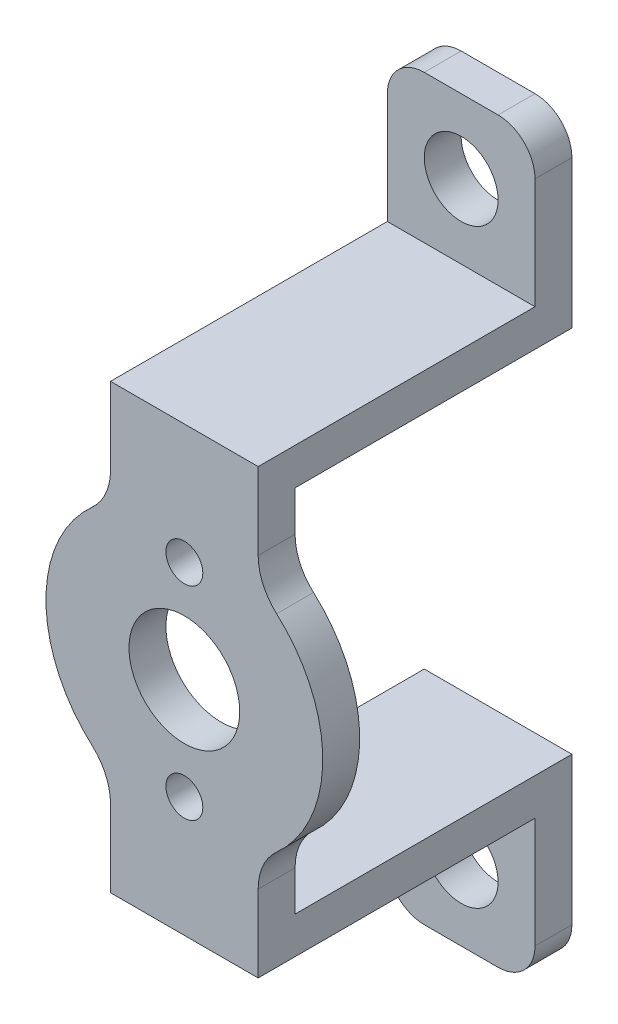
ISO-10303-21;
HEADER;
FILE_DESCRIPTION(('STEP AP214'),'2;1');
FILE_NAME('part.step','',(''),(''),'','','');
FILE_SCHEMA(('AUTOMOTIVE_DESIGN { 1 0 10303 214 1 1 1 1 }'));
ENDSEC;
DATA;
#1=APPLICATION_CONTEXT('core data for automotive mechanical design processes');
#2=APPLICATION_PROTOCOL_DEFINITION('international standard','automotive_design',2000,#1);
#3=PRODUCT_CONTEXT('',#1,'mechanical');
#4=PRODUCT('Part','Part','',(#3));
#5=PRODUCT_RELATED_PRODUCT_CATEGORY('part','',(#4));
#6=PRODUCT_DEFINITION_FORMATION('','',#4);
#7=PRODUCT_DEFINITION_CONTEXT('part definition',#1,'design');
#8=PRODUCT_DEFINITION('design','',#6,#7);
#9=PRODUCT_DEFINITION_SHAPE('','',#8);
#10=(LENGTH_UNIT() NAMED_UNIT(*) SI_UNIT(.MILLI.,.METRE.));
#11=(NAMED_UNIT(*) PLANE_ANGLE_UNIT() SI_UNIT($,.RADIAN.));
#12=(NAMED_UNIT(*) SI_UNIT($,.STERADIAN.) SOLID_ANGLE_UNIT());
#13=UNCERTAINTY_MEASURE_WITH_UNIT(LENGTH_MEASURE(1.E-05),#10,'distance_accuracy_value','');
#14=(GEOMETRIC_REPRESENTATION_CONTEXT(3) GLOBAL_UNCERTAINTY_ASSIGNED_CONTEXT((#13)) GLOBAL_UNIT_ASSIGNED_CONTEXT((#10,
#11,#12)) REPRESENTATION_CONTEXT('',''));
#15=CARTESIAN_POINT('',(0.,0.,0.));
#16=DIRECTION('',(0.,0.,1.));
#17=DIRECTION('',(1.,0.,0.));
#18=AXIS2_PLACEMENT_3D('',#15,#16,#17);
#19=CARTESIAN_POINT('',(0.,0.,2.));
#20=DIRECTION('',(0.,0.,-1.));
#21=DIRECTION('',(-1.,0.,0.));
#22=AXIS2_PLACEMENT_3D('',#19,#20,#21);
#23=CYLINDRICAL_SURFACE('',#22,7.5);
#24=CARTESIAN_POINT('',(0.,0.,0.));
#25=DIRECTION('',(0.,0.,1.));
#26=DIRECTION('',(1.,0.,0.));
#27=AXIS2_PLACEMENT_3D('',#24,#25,#26);
#28=CIRCLE('',#27,7.5);
#29=CARTESIAN_POINT('',(5.,-5.59016994374947,0.));
#30=VERTEX_POINT('',#29);
#31=CARTESIAN_POINT('',(5.,5.59016994374948,0.));
#32=VERTEX_POINT('',#31);
#33=EDGE_CURVE('E291',#30,#32,#28,.T.);
#34=ORIENTED_EDGE('',*,*,#33,.T.);
#35=DIRECTION('',(0.,0.,-1.));
#36=VECTOR('',#35,1.);
#37=CARTESIAN_POINT('',(5.,5.59016994374948,2.));
#38=LINE('',#37,#36);
#39=CARTESIAN_POINT('',(5.,5.59016994374948,2.));
#40=VERTEX_POINT('',#39);
#41=EDGE_CURVE('E347',#32,#40,#38,.F.);
#42=ORIENTED_EDGE('',*,*,#41,.T.);
#43=CARTESIAN_POINT('',(0.,0.,2.));
#44=DIRECTION('',(0.,0.,1.));
#45=DIRECTION('',(1.,0.,0.));
#46=AXIS2_PLACEMENT_3D('',#43,#44,#45);
#47=CIRCLE('',#46,7.5);
#48=CARTESIAN_POINT('',(5.,-5.59016994374947,2.));
#49=VERTEX_POINT('',#48);
#50=EDGE_CURVE('E300',#49,#40,#47,.T.);
#51=ORIENTED_EDGE('',*,*,#50,.F.);
#52=DIRECTION('',(0.,0.,-1.));
#53=VECTOR('',#52,1.);
#54=CARTESIAN_POINT('',(5.,-5.59016994374947,2.));
#55=LINE('',#54,#53);
#56=EDGE_CURVE('E344',#49,#30,#55,.T.);
#57=ORIENTED_EDGE('',*,*,#56,.T.);
#58=EDGE_LOOP('',(#34,#42,#51,#57));
#59=FACE_BOUND('',#58,.T.);
#60=ADVANCED_FACE('F36',(#59),#23,.T.);
#61=CARTESIAN_POINT('',(4.,0.,2.));
#62=DIRECTION('',(-1.,0.,0.));
#63=DIRECTION('',(0.,-1.,0.));
#64=AXIS2_PLACEMENT_3D('',#61,#62,#63);
#65=PLANE('',#64);
#66=DIRECTION('',(0.,-1.,0.));
#67=VECTOR('',#66,1.);
#68=CARTESIAN_POINT('',(4.,10.,-15.));
#69=LINE('',#68,#67);
#70=CARTESIAN_POINT('',(4.,18.,-15.));
#71=VERTEX_POINT('',#70);
#72=CARTESIAN_POINT('',(4.,10.,-15.));
#73=VERTEX_POINT('',#72);
#74=EDGE_CURVE('E245',#71,#73,#69,.T.);
#75=ORIENTED_EDGE('',*,*,#74,.F.);
#76=DIRECTION('',(0.,0.,1.));
#77=VECTOR('',#76,1.);
#78=CARTESIAN_POINT('',(4.,18.,2.));
#79=LINE('',#78,#77);
#80=CARTESIAN_POINT('',(4.,18.,-13.));
#81=VERTEX_POINT('',#80);
#82=EDGE_CURVE('E385',#71,#81,#79,.T.);
#83=ORIENTED_EDGE('',*,*,#82,.T.);
#84=DIRECTION('',(0.,-1.,0.));
#85=VECTOR('',#84,1.);
#86=CARTESIAN_POINT('',(4.,10.,-13.));
#87=LINE('',#86,#85);
#88=CARTESIAN_POINT('',(4.,12.,-13.));
#89=VERTEX_POINT('',#88);
#90=EDGE_CURVE('E229',#81,#89,#87,.T.);
#91=ORIENTED_EDGE('',*,*,#90,.T.);
#92=DIRECTION('',(0.,0.,1.));
#93=VECTOR('',#92,1.);
#94=CARTESIAN_POINT('',(4.,12.,-13.));
#95=LINE('',#94,#93);
#96=CARTESIAN_POINT('',(4.,12.,2.));
#97=VERTEX_POINT('',#96);
#98=EDGE_CURVE('E292',#89,#97,#95,.T.);
#99=ORIENTED_EDGE('',*,*,#98,.T.);
#100=DIRECTION('',(0.,1.,0.));
#101=VECTOR('',#100,1.);
#102=CARTESIAN_POINT('',(4.,0.,2.));
#103=LINE('',#102,#101);
#104=CARTESIAN_POINT('',(4.,7.82623792124926,2.));
#105=VERTEX_POINT('',#104);
#106=EDGE_CURVE('E303',#105,#97,#103,.T.);
#107=ORIENTED_EDGE('',*,*,#106,.F.);
#108=DIRECTION('',(0.,0.,1.));
#109=VECTOR('',#108,1.);
#110=CARTESIAN_POINT('',(4.,7.82623792124926,0.));
#111=LINE('',#110,#109);
#112=CARTESIAN_POINT('',(4.,7.82623792124926,0.));
#113=VERTEX_POINT('',#112);
#114=EDGE_CURVE('E341',#105,#113,#111,.F.);
#115=ORIENTED_EDGE('',*,*,#114,.T.);
#116=DIRECTION('',(0.,1.,0.));
#117=VECTOR('',#116,1.);
#118=CARTESIAN_POINT('',(4.,0.,0.));
#119=LINE('',#118,#117);
#120=CARTESIAN_POINT('',(4.,10.,0.));
#121=VERTEX_POINT('',#120);
#122=EDGE_CURVE('E320',#113,#121,#119,.T.);
#123=ORIENTED_EDGE('',*,*,#122,.T.);
#124=DIRECTION('',(0.,0.,1.));
#125=VECTOR('',#124,1.);
#126=CARTESIAN_POINT('',(4.,10.,-13.));
#127=LINE('',#126,#125);
#128=EDGE_CURVE('E295',#73,#121,#127,.T.);
#129=ORIENTED_EDGE('',*,*,#128,.F.);
#130=EDGE_LOOP('',(#75,#83,#91,#99,#107,#115,#123,#129));
#131=FACE_BOUND('',#130,.T.);
#132=ADVANCED_FACE('F406',(#131),#65,.F.);
#133=CARTESIAN_POINT('',(-4.,0.,2.));
#134=DIRECTION('',(-1.,0.,0.));
#135=DIRECTION('',(0.,0.,1.));
#136=AXIS2_PLACEMENT_3D('',#133,#134,#135);
#137=PLANE('',#136);
#138=DIRECTION('',(0.,1.,0.));
#139=VECTOR('',#138,1.);
#140=CARTESIAN_POINT('',(-4.,10.,-13.));
#141=LINE('',#140,#139);
#142=CARTESIAN_POINT('',(-4.,12.,-13.));
#143=VERTEX_POINT('',#142);
#144=CARTESIAN_POINT('',(-4.,18.,-13.));
#145=VERTEX_POINT('',#144);
#146=EDGE_CURVE('E231',#143,#145,#141,.T.);
#147=ORIENTED_EDGE('',*,*,#146,.T.);
#148=DIRECTION('',(0.,0.,1.));
#149=VECTOR('',#148,1.);
#150=CARTESIAN_POINT('',(-4.,18.,-15.));
#151=LINE('',#150,#149);
#152=CARTESIAN_POINT('',(-4.,18.,-15.));
#153=VERTEX_POINT('',#152);
#154=EDGE_CURVE('E11',#145,#153,#151,.F.);
#155=ORIENTED_EDGE('',*,*,#154,.T.);
#156=DIRECTION('',(0.,1.,0.));
#157=VECTOR('',#156,1.);
#158=CARTESIAN_POINT('',(-4.,10.,-15.));
#159=LINE('',#158,#157);
#160=CARTESIAN_POINT('',(-4.,10.,-15.));
#161=VERTEX_POINT('',#160);
#162=EDGE_CURVE('E251',#161,#153,#159,.T.);
#163=ORIENTED_EDGE('',*,*,#162,.F.);
#164=DIRECTION('',(0.,0.,1.));
#165=VECTOR('',#164,1.);
#166=CARTESIAN_POINT('',(-4.,10.,-13.));
#167=LINE('',#166,#165);
#168=CARTESIAN_POINT('',(-4.,10.,0.));
#169=VERTEX_POINT('',#168);
#170=EDGE_CURVE('E285',#161,#169,#167,.T.);
#171=ORIENTED_EDGE('',*,*,#170,.T.);
#172=DIRECTION('',(0.,1.,0.));
#173=VECTOR('',#172,1.);
#174=CARTESIAN_POINT('',(-4.,0.,0.));
#175=LINE('',#174,#173);
#176=CARTESIAN_POINT('',(-4.,7.82623792124926,0.));
#177=VERTEX_POINT('',#176);
#178=EDGE_CURVE('E325',#177,#169,#175,.T.);
#179=ORIENTED_EDGE('',*,*,#178,.F.);
#180=DIRECTION('',(0.,0.,-1.));
#181=VECTOR('',#180,1.);
#182=CARTESIAN_POINT('',(-4.,7.82623792124926,2.));
#183=LINE('',#182,#181);
#184=CARTESIAN_POINT('',(-4.,7.82623792124926,2.));
#185=VERTEX_POINT('',#184);
#186=EDGE_CURVE('E339',#177,#185,#183,.F.);
#187=ORIENTED_EDGE('',*,*,#186,.T.);
#188=DIRECTION('',(0.,1.,0.));
#189=VECTOR('',#188,1.);
#190=CARTESIAN_POINT('',(-4.,0.,2.));
#191=LINE('',#190,#189);
#192=CARTESIAN_POINT('',(-4.,12.,2.));
#193=VERTEX_POINT('',#192);
#194=EDGE_CURVE('E306',#185,#193,#191,.T.);
#195=ORIENTED_EDGE('',*,*,#194,.T.);
#196=DIRECTION('',(0.,0.,1.));
#197=VECTOR('',#196,1.);
#198=CARTESIAN_POINT('',(-4.,12.,-13.));
#199=LINE('',#198,#197);
#200=EDGE_CURVE('E288',#143,#193,#199,.T.);
#201=ORIENTED_EDGE('',*,*,#200,.F.);
#202=EDGE_LOOP('',(#147,#155,#163,#171,#179,#187,#195,#201));
#203=FACE_BOUND('',#202,.T.);
#204=ADVANCED_FACE('F419',(#203),#137,.T.);
#205=CARTESIAN_POINT('',(0.,0.,2.));
#206=DIRECTION('',(0.,0.,-1.));
#207=DIRECTION('',(-1.,0.,0.));
#208=AXIS2_PLACEMENT_3D('',#205,#206,#207);
#209=CYLINDRICAL_SURFACE('',#208,7.5);
#210=CARTESIAN_POINT('',(0.,0.,2.));
#211=DIRECTION('',(0.,0.,1.));
#212=DIRECTION('',(1.,0.,0.));
#213=AXIS2_PLACEMENT_3D('',#210,#211,#212);
#214=CIRCLE('',#213,7.5);
#215=CARTESIAN_POINT('',(-5.,5.59016994374947,2.));
#216=VERTEX_POINT('',#215);
#217=CARTESIAN_POINT('',(-5.,-5.59016994374947,2.));
#218=VERTEX_POINT('',#217);
#219=EDGE_CURVE('E308',#216,#218,#214,.T.);
#220=ORIENTED_EDGE('',*,*,#219,.F.);
#221=DIRECTION('',(0.,0.,-1.));
#222=VECTOR('',#221,1.);
#223=CARTESIAN_POINT('',(-5.,5.59016994374947,2.));
#224=LINE('',#223,#222);
#225=CARTESIAN_POINT('',(-5.,5.59016994374947,0.));
#226=VERTEX_POINT('',#225);
#227=EDGE_CURVE('E336',#216,#226,#224,.T.);
#228=ORIENTED_EDGE('',*,*,#227,.T.);
#229=CARTESIAN_POINT('',(0.,0.,0.));
#230=DIRECTION('',(0.,0.,1.));
#231=DIRECTION('',(1.,0.,0.));
#232=AXIS2_PLACEMENT_3D('',#229,#230,#231);
#233=CIRCLE('',#232,7.5);
#234=CARTESIAN_POINT('',(-5.,-5.59016994374947,0.));
#235=VERTEX_POINT('',#234);
#236=EDGE_CURVE('E327',#226,#235,#233,.T.);
#237=ORIENTED_EDGE('',*,*,#236,.T.);
#238=DIRECTION('',(0.,0.,-1.));
#239=VECTOR('',#238,1.);
#240=CARTESIAN_POINT('',(-5.,-5.59016994374947,2.));
#241=LINE('',#240,#239);
#242=EDGE_CURVE('E317',#235,#218,#241,.F.);
#243=ORIENTED_EDGE('',*,*,#242,.T.);
#244=EDGE_LOOP('',(#220,#228,#237,#243));
#245=FACE_BOUND('',#244,.T.);
#246=ADVANCED_FACE('F725',(#245),#209,.T.);
#247=CARTESIAN_POINT('',(-4.,0.,2.));
#248=DIRECTION('',(-1.,0.,0.));
#249=DIRECTION('',(0.,0.,1.));
#250=AXIS2_PLACEMENT_3D('',#247,#248,#249);
#251=PLANE('',#250);
#252=DIRECTION('',(0.,1.,0.));
#253=VECTOR('',#252,1.);
#254=CARTESIAN_POINT('',(-4.,-10.,-15.));
#255=LINE('',#254,#253);
#256=CARTESIAN_POINT('',(-4.,-18.,-15.));
#257=VERTEX_POINT('',#256);
#258=CARTESIAN_POINT('',(-4.,-10.,-15.));
#259=VERTEX_POINT('',#258);
#260=EDGE_CURVE('E200',#257,#259,#255,.T.);
#261=ORIENTED_EDGE('',*,*,#260,.F.);
#262=DIRECTION('',(0.,0.,1.));
#263=VECTOR('',#262,1.);
#264=CARTESIAN_POINT('',(-4.,-18.,-13.));
#265=LINE('',#264,#263);
#266=CARTESIAN_POINT('',(-4.,-18.,-13.));
#267=VERTEX_POINT('',#266);
#268=EDGE_CURVE('E369',#257,#267,#265,.T.);
#269=ORIENTED_EDGE('',*,*,#268,.T.);
#270=DIRECTION('',(0.,1.,0.));
#271=VECTOR('',#270,1.);
#272=CARTESIAN_POINT('',(-4.,-10.,-13.));
#273=LINE('',#272,#271);
#274=CARTESIAN_POINT('',(-4.,-12.,-13.));
#275=VERTEX_POINT('',#274);
#276=EDGE_CURVE('E242',#267,#275,#273,.T.);
#277=ORIENTED_EDGE('',*,*,#276,.T.);
#278=DIRECTION('',(0.,0.,1.));
#279=VECTOR('',#278,1.);
#280=CARTESIAN_POINT('',(-4.,-12.,-13.));
#281=LINE('',#280,#279);
#282=CARTESIAN_POINT('',(-4.,-12.,2.));
#283=VERTEX_POINT('',#282);
#284=EDGE_CURVE('E273',#275,#283,#281,.T.);
#285=ORIENTED_EDGE('',*,*,#284,.T.);
#286=DIRECTION('',(0.,1.,0.));
#287=VECTOR('',#286,1.);
#288=CARTESIAN_POINT('',(-4.,0.,2.));
#289=LINE('',#288,#287);
#290=CARTESIAN_POINT('',(-4.,-7.82623792124926,2.));
#291=VERTEX_POINT('',#290);
#292=EDGE_CURVE('E311',#283,#291,#289,.T.);
#293=ORIENTED_EDGE('',*,*,#292,.T.);
#294=DIRECTION('',(0.,0.,-1.));
#295=VECTOR('',#294,1.);
#296=CARTESIAN_POINT('',(-4.,-7.82623792124926,2.));
#297=LINE('',#296,#295);
#298=CARTESIAN_POINT('',(-4.,-7.82623792124926,0.));
#299=VERTEX_POINT('',#298);
#300=EDGE_CURVE('E351',#291,#299,#297,.T.);
#301=ORIENTED_EDGE('',*,*,#300,.T.);
#302=DIRECTION('',(0.,1.,0.));
#303=VECTOR('',#302,1.);
#304=CARTESIAN_POINT('',(-4.,0.,0.));
#305=LINE('',#304,#303);
#306=CARTESIAN_POINT('',(-4.,-10.,0.));
#307=VERTEX_POINT('',#306);
#308=EDGE_CURVE('E221',#307,#299,#305,.T.);
#309=ORIENTED_EDGE('',*,*,#308,.F.);
#310=DIRECTION('',(0.,0.,1.));
#311=VECTOR('',#310,1.);
#312=CARTESIAN_POINT('',(-4.,-10.,-13.));
#313=LINE('',#312,#311);
#314=EDGE_CURVE('E217',#259,#307,#313,.T.);
#315=ORIENTED_EDGE('',*,*,#314,.F.);
#316=EDGE_LOOP('',(#261,#269,#277,#285,#293,#301,#309,#315));
#317=FACE_BOUND('',#316,.T.);
#318=ADVANCED_FACE('F218',(#317),#251,.T.);
#319=CARTESIAN_POINT('',(4.,0.,2.));
#320=DIRECTION('',(-1.,0.,0.));
#321=DIRECTION('',(0.,-1.,0.));
#322=AXIS2_PLACEMENT_3D('',#319,#320,#321);
#323=PLANE('',#322);
#324=DIRECTION('',(0.,-1.,0.));
#325=VECTOR('',#324,1.);
#326=CARTESIAN_POINT('',(4.,-10.,-13.));
#327=LINE('',#326,#325);
#328=CARTESIAN_POINT('',(4.,-12.,-13.));
#329=VERTEX_POINT('',#328);
#330=CARTESIAN_POINT('',(4.,-18.,-13.));
#331=VERTEX_POINT('',#330);
#332=EDGE_CURVE('E235',#329,#331,#327,.T.);
#333=ORIENTED_EDGE('',*,*,#332,.T.);
#334=DIRECTION('',(0.,0.,1.));
#335=VECTOR('',#334,1.);
#336=CARTESIAN_POINT('',(4.,-18.,2.));
#337=LINE('',#336,#335);
#338=CARTESIAN_POINT('',(4.,-18.,-15.));
#339=VERTEX_POINT('',#338);
#340=EDGE_CURVE('E383',#331,#339,#337,.F.);
#341=ORIENTED_EDGE('',*,*,#340,.T.);
#342=DIRECTION('',(0.,-1.,0.));
#343=VECTOR('',#342,1.);
#344=CARTESIAN_POINT('',(4.,-10.,-15.));
#345=LINE('',#344,#343);
#346=CARTESIAN_POINT('',(4.,-10.,-15.));
#347=VERTEX_POINT('',#346);
#348=EDGE_CURVE('E244',#347,#339,#345,.T.);
#349=ORIENTED_EDGE('',*,*,#348,.F.);
#350=DIRECTION('',(0.,0.,1.));
#351=VECTOR('',#350,1.);
#352=CARTESIAN_POINT('',(4.,-10.,-13.));
#353=LINE('',#352,#351);
#354=CARTESIAN_POINT('',(4.,-10.,0.));
#355=VERTEX_POINT('',#354);
#356=EDGE_CURVE('E225',#347,#355,#353,.T.);
#357=ORIENTED_EDGE('',*,*,#356,.T.);
#358=DIRECTION('',(0.,1.,0.));
#359=VECTOR('',#358,1.);
#360=CARTESIAN_POINT('',(4.,0.,0.));
#361=LINE('',#360,#359);
#362=CARTESIAN_POINT('',(4.,-7.82623792124926,0.));
#363=VERTEX_POINT('',#362);
#364=EDGE_CURVE('E304',#355,#363,#361,.T.);
#365=ORIENTED_EDGE('',*,*,#364,.T.);
#366=DIRECTION('',(0.,0.,1.));
#367=VECTOR('',#366,1.);
#368=CARTESIAN_POINT('',(4.,-7.82623792124926,2.));
#369=LINE('',#368,#367);
#370=CARTESIAN_POINT('',(4.,-7.82623792124926,2.));
#371=VERTEX_POINT('',#370);
#372=EDGE_CURVE('E349',#363,#371,#369,.T.);
#373=ORIENTED_EDGE('',*,*,#372,.T.);
#374=DIRECTION('',(0.,1.,0.));
#375=VECTOR('',#374,1.);
#376=CARTESIAN_POINT('',(4.,0.,2.));
#377=LINE('',#376,#375);
#378=CARTESIAN_POINT('',(4.,-12.,2.));
#379=VERTEX_POINT('',#378);
#380=EDGE_CURVE('E314',#379,#371,#377,.T.);
#381=ORIENTED_EDGE('',*,*,#380,.F.);
#382=DIRECTION('',(0.,0.,1.));
#383=VECTOR('',#382,1.);
#384=CARTESIAN_POINT('',(4.,-12.,-13.));
#385=LINE('',#384,#383);
#386=EDGE_CURVE('E277',#329,#379,#385,.T.);
#387=ORIENTED_EDGE('',*,*,#386,.F.);
#388=EDGE_LOOP('',(#333,#341,#349,#357,#365,#373,#381,#387));
#389=FACE_BOUND('',#388,.T.);
#390=ADVANCED_FACE('F444',(#389),#323,.F.);
#391=CARTESIAN_POINT('',(0.,0.,2.));
#392=DIRECTION('',(0.,0.,1.));
#393=DIRECTION('',(1.,0.,0.));
#394=AXIS2_PLACEMENT_3D('',#391,#392,#393);
#395=PLANE('',#394);
#396=CARTESIAN_POINT('',(0.,0.,2.));
#397=DIRECTION('',(0.,0.,1.));
#398=DIRECTION('',(1.,0.,0.));
#399=AXIS2_PLACEMENT_3D('',#396,#397,#398);
#400=CIRCLE('',#399,3.);
#401=CARTESIAN_POINT('',(3.,0.,2.));
#402=VERTEX_POINT('',#401);
#403=EDGE_CURVE('E460',#402,#402,#400,.T.);
#404=ORIENTED_EDGE('',*,*,#403,.F.);
#405=EDGE_LOOP('',(#404));
#406=FACE_BOUND('',#405,.T.);
#407=CARTESIAN_POINT('',(0.,5.5,2.));
#408=DIRECTION('',(0.,0.,1.));
#409=DIRECTION('',(1.,0.,0.));
#410=AXIS2_PLACEMENT_3D('',#407,#408,#409);
#411=CIRCLE('',#410,1.);
#412=CARTESIAN_POINT('',(1.,5.5,2.));
#413=VERTEX_POINT('',#412);
#414=EDGE_CURVE('E266',#413,#413,#411,.T.);
#415=ORIENTED_EDGE('',*,*,#414,.F.);
#416=EDGE_LOOP('',(#415));
#417=FACE_BOUND('',#416,.T.);
#418=CARTESIAN_POINT('',(0.,-5.5,2.));
#419=DIRECTION('',(0.,0.,1.));
#420=DIRECTION('',(1.,0.,0.));
#421=AXIS2_PLACEMENT_3D('',#418,#419,#420);
#422=CIRCLE('',#421,1.);
#423=CARTESIAN_POINT('',(1.,-5.5,2.));
#424=VERTEX_POINT('',#423);
#425=EDGE_CURVE('E261',#424,#424,#422,.T.);
#426=ORIENTED_EDGE('',*,*,#425,.F.);
#427=EDGE_LOOP('',(#426));
#428=FACE_BOUND('',#427,.T.);
#429=ORIENTED_EDGE('',*,*,#380,.T.);
#430=CARTESIAN_POINT('',(7.,-7.82623792124926,2.));
#431=DIRECTION('',(0.,0.,1.));
#432=DIRECTION('',(1.,0.,0.));
#433=AXIS2_PLACEMENT_3D('',#430,#431,#432);
#434=CIRCLE('',#433,3.);
#435=EDGE_CURVE('E363',#371,#49,#434,.F.);
#436=ORIENTED_EDGE('',*,*,#435,.T.);
#437=ORIENTED_EDGE('',*,*,#50,.T.);
#438=CARTESIAN_POINT('',(7.,7.82623792124926,2.));
#439=DIRECTION('',(0.,0.,1.));
#440=DIRECTION('',(1.,0.,0.));
#441=AXIS2_PLACEMENT_3D('',#438,#439,#440);
#442=CIRCLE('',#441,3.);
#443=EDGE_CURVE('E359',#40,#105,#442,.F.);
#444=ORIENTED_EDGE('',*,*,#443,.T.);
#445=ORIENTED_EDGE('',*,*,#106,.T.);
#446=DIRECTION('',(-1.,0.,0.));
#447=VECTOR('',#446,1.);
#448=CARTESIAN_POINT('',(-4.,12.,2.));
#449=LINE('',#448,#447);
#450=EDGE_CURVE('E224',#97,#193,#449,.T.);
#451=ORIENTED_EDGE('',*,*,#450,.T.);
#452=ORIENTED_EDGE('',*,*,#194,.F.);
#453=CARTESIAN_POINT('',(-7.,7.82623792124926,2.));
#454=DIRECTION('',(0.,0.,1.));
#455=DIRECTION('',(1.,0.,0.));
#456=AXIS2_PLACEMENT_3D('',#453,#454,#455);
#457=CIRCLE('',#456,3.);
#458=EDGE_CURVE('E355',#185,#216,#457,.F.);
#459=ORIENTED_EDGE('',*,*,#458,.T.);
#460=ORIENTED_EDGE('',*,*,#219,.T.);
#461=CARTESIAN_POINT('',(-7.,-7.82623792124926,2.));
#462=DIRECTION('',(0.,0.,1.));
#463=DIRECTION('',(1.,0.,0.));
#464=AXIS2_PLACEMENT_3D('',#461,#462,#463);
#465=CIRCLE('',#464,3.);
#466=EDGE_CURVE('E367',#218,#291,#465,.F.);
#467=ORIENTED_EDGE('',*,*,#466,.T.);
#468=ORIENTED_EDGE('',*,*,#292,.F.);
#469=DIRECTION('',(1.,0.,0.));
#470=VECTOR('',#469,1.);
#471=CARTESIAN_POINT('',(-4.,-12.,2.));
#472=LINE('',#471,#470);
#473=EDGE_CURVE('E269',#283,#379,#472,.T.);
#474=ORIENTED_EDGE('',*,*,#473,.T.);
#475=EDGE_LOOP('',(#429,#436,#437,#444,#445,#451,#452,#459,#460,#467,#468,#474));
#476=FACE_BOUND('',#475,.T.);
#477=ADVANCED_FACE('F519',(#406,#417,#428,#476),#395,.T.);
#478=CARTESIAN_POINT('',(0.,0.,0.));
#479=DIRECTION('',(0.,0.,1.));
#480=DIRECTION('',(1.,0.,0.));
#481=AXIS2_PLACEMENT_3D('',#478,#479,#480);
#482=PLANE('',#481);
#483=CARTESIAN_POINT('',(0.,0.,0.));
#484=DIRECTION('',(0.,0.,1.));
#485=DIRECTION('',(1.,0.,0.));
#486=AXIS2_PLACEMENT_3D('',#483,#484,#485);
#487=CIRCLE('',#486,3.);
#488=CARTESIAN_POINT('',(3.,0.,0.));
#489=VERTEX_POINT('',#488);
#490=EDGE_CURVE('E40',#489,#489,#487,.T.);
#491=ORIENTED_EDGE('',*,*,#490,.T.);
#492=EDGE_LOOP('',(#491));
#493=FACE_BOUND('',#492,.T.);
#494=CARTESIAN_POINT('',(0.,5.5,0.));
#495=DIRECTION('',(0.,0.,-1.));
#496=DIRECTION('',(-1.,0.,0.));
#497=AXIS2_PLACEMENT_3D('',#494,#495,#496);
#498=CIRCLE('',#497,1.);
#499=CARTESIAN_POINT('',(-1.,5.5,0.));
#500=VERTEX_POINT('',#499);
#501=EDGE_CURVE('E258',#500,#500,#498,.T.);
#502=ORIENTED_EDGE('',*,*,#501,.F.);
#503=EDGE_LOOP('',(#502));
#504=FACE_BOUND('',#503,.T.);
#505=CARTESIAN_POINT('',(0.,-5.5,0.));
#506=DIRECTION('',(0.,0.,-1.));
#507=DIRECTION('',(-1.,0.,0.));
#508=AXIS2_PLACEMENT_3D('',#505,#506,#507);
#509=CIRCLE('',#508,1.);
#510=CARTESIAN_POINT('',(-1.,-5.5,0.));
#511=VERTEX_POINT('',#510);
#512=EDGE_CURVE('E254',#511,#511,#509,.T.);
#513=ORIENTED_EDGE('',*,*,#512,.F.);
#514=EDGE_LOOP('',(#513));
#515=FACE_BOUND('',#514,.T.);
#516=ORIENTED_EDGE('',*,*,#33,.F.);
#517=CARTESIAN_POINT('',(7.,-7.82623792124926,0.));
#518=DIRECTION('',(0.,0.,1.));
#519=DIRECTION('',(1.,0.,0.));
#520=AXIS2_PLACEMENT_3D('',#517,#518,#519);
#521=CIRCLE('',#520,3.);
#522=EDGE_CURVE('E361',#30,#363,#521,.T.);
#523=ORIENTED_EDGE('',*,*,#522,.T.);
#524=ORIENTED_EDGE('',*,*,#364,.F.);
#525=DIRECTION('',(1.,0.,0.));
#526=VECTOR('',#525,1.);
#527=CARTESIAN_POINT('',(0.,-10.,0.));
#528=LINE('',#527,#526);
#529=EDGE_CURVE('E331',#307,#355,#528,.T.);
#530=ORIENTED_EDGE('',*,*,#529,.F.);
#531=ORIENTED_EDGE('',*,*,#308,.T.);
#532=CARTESIAN_POINT('',(-7.,-7.82623792124926,0.));
#533=DIRECTION('',(0.,0.,1.));
#534=DIRECTION('',(1.,0.,0.));
#535=AXIS2_PLACEMENT_3D('',#532,#533,#534);
#536=CIRCLE('',#535,3.);
#537=EDGE_CURVE('E365',#299,#235,#536,.T.);
#538=ORIENTED_EDGE('',*,*,#537,.T.);
#539=ORIENTED_EDGE('',*,*,#236,.F.);
#540=CARTESIAN_POINT('',(-7.,7.82623792124926,0.));
#541=DIRECTION('',(0.,0.,1.));
#542=DIRECTION('',(1.,0.,0.));
#543=AXIS2_PLACEMENT_3D('',#540,#541,#542);
#544=CIRCLE('',#543,3.);
#545=EDGE_CURVE('E353',#226,#177,#544,.T.);
#546=ORIENTED_EDGE('',*,*,#545,.T.);
#547=ORIENTED_EDGE('',*,*,#178,.T.);
#548=DIRECTION('',(1.,0.,0.));
#549=VECTOR('',#548,1.);
#550=CARTESIAN_POINT('',(0.,10.,0.));
#551=LINE('',#550,#549);
#552=EDGE_CURVE('E322',#169,#121,#551,.T.);
#553=ORIENTED_EDGE('',*,*,#552,.T.);
#554=ORIENTED_EDGE('',*,*,#122,.F.);
#555=CARTESIAN_POINT('',(7.,7.82623792124926,0.));
#556=DIRECTION('',(0.,0.,1.));
#557=DIRECTION('',(1.,0.,0.));
#558=AXIS2_PLACEMENT_3D('',#555,#556,#557);
#559=CIRCLE('',#558,3.);
#560=EDGE_CURVE('E357',#113,#32,#559,.T.);
#561=ORIENTED_EDGE('',*,*,#560,.T.);
#562=EDGE_LOOP('',(#516,#523,#524,#530,#531,#538,#539,#546,#547,#553,#554,#561));
#563=FACE_BOUND('',#562,.T.);
#564=ADVANCED_FACE('F435',(#493,#504,#515,#563),#482,.F.);
#565=CARTESIAN_POINT('',(-4.,10.,-13.));
#566=DIRECTION('',(0.,-1.,0.));
#567=DIRECTION('',(0.,0.,-1.));
#568=AXIS2_PLACEMENT_3D('',#565,#566,#567);
#569=PLANE('',#568);
#570=ORIENTED_EDGE('',*,*,#552,.F.);
#571=ORIENTED_EDGE('',*,*,#170,.F.);
#572=DIRECTION('',(-1.,0.,0.));
#573=VECTOR('',#572,1.);
#574=CARTESIAN_POINT('',(4.,10.,-15.));
#575=LINE('',#574,#573);
#576=EDGE_CURVE('E247',#73,#161,#575,.T.);
#577=ORIENTED_EDGE('',*,*,#576,.F.);
#578=ORIENTED_EDGE('',*,*,#128,.T.);
#579=EDGE_LOOP('',(#570,#571,#577,#578));
#580=FACE_BOUND('',#579,.T.);
#581=ADVANCED_FACE('F535',(#580),#569,.T.);
#582=CARTESIAN_POINT('',(-4.,12.,-13.));
#583=DIRECTION('',(0.,1.,0.));
#584=DIRECTION('',(0.,0.,1.));
#585=AXIS2_PLACEMENT_3D('',#582,#583,#584);
#586=PLANE('',#585);
#587=ORIENTED_EDGE('',*,*,#450,.F.);
#588=ORIENTED_EDGE('',*,*,#98,.F.);
#589=DIRECTION('',(-1.,0.,0.));
#590=VECTOR('',#589,1.);
#591=CARTESIAN_POINT('',(-4.,12.,-13.));
#592=LINE('',#591,#590);
#593=EDGE_CURVE('E282',#89,#143,#592,.T.);
#594=ORIENTED_EDGE('',*,*,#593,.T.);
#595=ORIENTED_EDGE('',*,*,#200,.T.);
#596=EDGE_LOOP('',(#587,#588,#594,#595));
#597=FACE_BOUND('',#596,.T.);
#598=ADVANCED_FACE('F424',(#597),#586,.T.);
#599=CARTESIAN_POINT('',(-4.,-10.,-13.));
#600=DIRECTION('',(0.,1.,0.));
#601=DIRECTION('',(0.,0.,1.));
#602=AXIS2_PLACEMENT_3D('',#599,#600,#601);
#603=PLANE('',#602);
#604=ORIENTED_EDGE('',*,*,#314,.T.);
#605=ORIENTED_EDGE('',*,*,#529,.T.);
#606=ORIENTED_EDGE('',*,*,#356,.F.);
#607=DIRECTION('',(1.,0.,0.));
#608=VECTOR('',#607,1.);
#609=CARTESIAN_POINT('',(4.,-10.,-15.));
#610=LINE('',#609,#608);
#611=EDGE_CURVE('E206',#259,#347,#610,.T.);
#612=ORIENTED_EDGE('',*,*,#611,.F.);
#613=EDGE_LOOP('',(#604,#605,#606,#612));
#614=FACE_BOUND('',#613,.T.);
#615=ADVANCED_FACE('F227',(#614),#603,.T.);
#616=CARTESIAN_POINT('',(-4.,-12.,-13.));
#617=DIRECTION('',(0.,-1.,0.));
#618=DIRECTION('',(0.,0.,-1.));
#619=AXIS2_PLACEMENT_3D('',#616,#617,#618);
#620=PLANE('',#619);
#621=ORIENTED_EDGE('',*,*,#473,.F.);
#622=ORIENTED_EDGE('',*,*,#284,.F.);
#623=DIRECTION('',(1.,0.,0.));
#624=VECTOR('',#623,1.);
#625=CARTESIAN_POINT('',(-4.,-12.,-13.));
#626=LINE('',#625,#624);
#627=EDGE_CURVE('E270',#275,#329,#626,.T.);
#628=ORIENTED_EDGE('',*,*,#627,.T.);
#629=ORIENTED_EDGE('',*,*,#386,.T.);
#630=EDGE_LOOP('',(#621,#622,#628,#629));
#631=FACE_BOUND('',#630,.T.);
#632=ADVANCED_FACE('F563',(#631),#620,.T.);
#633=CARTESIAN_POINT('',(0.,-5.5,8.));
#634=DIRECTION('',(0.,0.,-1.));
#635=DIRECTION('',(-1.,0.,0.));
#636=AXIS2_PLACEMENT_3D('',#633,#634,#635);
#637=CYLINDRICAL_SURFACE('',#636,1.);
#638=ORIENTED_EDGE('',*,*,#425,.T.);
#639=EDGE_LOOP('',(#638));
#640=FACE_BOUND('',#639,.T.);
#641=ORIENTED_EDGE('',*,*,#512,.T.);
#642=EDGE_LOOP('',(#641));
#643=FACE_BOUND('',#642,.T.);
#644=ADVANCED_FACE('F570',(#640,#643),#637,.F.);
#645=CARTESIAN_POINT('',(0.,5.5,8.));
#646=DIRECTION('',(0.,0.,-1.));
#647=DIRECTION('',(-1.,0.,0.));
#648=AXIS2_PLACEMENT_3D('',#645,#646,#647);
#649=CYLINDRICAL_SURFACE('',#648,1.);
#650=ORIENTED_EDGE('',*,*,#414,.T.);
#651=EDGE_LOOP('',(#650));
#652=FACE_BOUND('',#651,.T.);
#653=ORIENTED_EDGE('',*,*,#501,.T.);
#654=EDGE_LOOP('',(#653));
#655=FACE_BOUND('',#654,.T.);
#656=ADVANCED_FACE('F579',(#652,#655),#649,.F.);
#657=CARTESIAN_POINT('',(0.,0.,-13.));
#658=DIRECTION('',(0.,0.,1.));
#659=DIRECTION('',(1.,0.,0.));
#660=AXIS2_PLACEMENT_3D('',#657,#658,#659);
#661=PLANE('',#660);
#662=CARTESIAN_POINT('',(0.,16.,-13.));
#663=DIRECTION('',(0.,0.,1.));
#664=DIRECTION('',(1.,0.,0.));
#665=AXIS2_PLACEMENT_3D('',#662,#663,#664);
#666=CIRCLE('',#665,2.);
#667=CARTESIAN_POINT('',(2.,16.,-13.));
#668=VERTEX_POINT('',#667);
#669=EDGE_CURVE('E455',#668,#668,#666,.T.);
#670=ORIENTED_EDGE('',*,*,#669,.F.);
#671=EDGE_LOOP('',(#670));
#672=FACE_BOUND('',#671,.T.);
#673=ORIENTED_EDGE('',*,*,#90,.F.);
#674=CARTESIAN_POINT('',(2.,18.,-13.));
#675=DIRECTION('',(0.,0.,1.));
#676=DIRECTION('',(1.,0.,0.));
#677=AXIS2_PLACEMENT_3D('',#674,#675,#676);
#678=CIRCLE('',#677,2.);
#679=CARTESIAN_POINT('',(2.,20.,-13.));
#680=VERTEX_POINT('',#679);
#681=EDGE_CURVE('E390',#81,#680,#678,.T.);
#682=ORIENTED_EDGE('',*,*,#681,.T.);
#683=DIRECTION('',(1.,0.,0.));
#684=VECTOR('',#683,1.);
#685=CARTESIAN_POINT('',(4.,20.,-13.));
#686=LINE('',#685,#684);
#687=CARTESIAN_POINT('',(-2.,20.,-13.));
#688=VERTEX_POINT('',#687);
#689=EDGE_CURVE('E248',#688,#680,#686,.T.);
#690=ORIENTED_EDGE('',*,*,#689,.F.);
#691=CARTESIAN_POINT('',(-2.,18.,-13.));
#692=DIRECTION('',(0.,0.,1.));
#693=DIRECTION('',(1.,0.,0.));
#694=AXIS2_PLACEMENT_3D('',#691,#692,#693);
#695=CIRCLE('',#694,2.);
#696=EDGE_CURVE('E388',#688,#145,#695,.T.);
#697=ORIENTED_EDGE('',*,*,#696,.T.);
#698=ORIENTED_EDGE('',*,*,#146,.F.);
#699=ORIENTED_EDGE('',*,*,#593,.F.);
#700=EDGE_LOOP('',(#673,#682,#690,#697,#698,#699));
#701=FACE_BOUND('',#700,.T.);
#702=ADVANCED_FACE('F412',(#672,#701),#661,.T.);
#703=CARTESIAN_POINT('',(4.,20.,-15.));
#704=DIRECTION('',(0.,-1.,0.));
#705=DIRECTION('',(0.,0.,-1.));
#706=AXIS2_PLACEMENT_3D('',#703,#704,#705);
#707=PLANE('',#706);
#708=ORIENTED_EDGE('',*,*,#689,.T.);
#709=DIRECTION('',(0.,0.,1.));
#710=VECTOR('',#709,1.);
#711=CARTESIAN_POINT('',(2.,20.,-15.));
#712=LINE('',#711,#710);
#713=CARTESIAN_POINT('',(2.,20.,-15.));
#714=VERTEX_POINT('',#713);
#715=EDGE_CURVE('E58',#680,#714,#712,.F.);
#716=ORIENTED_EDGE('',*,*,#715,.T.);
#717=DIRECTION('',(1.,0.,0.));
#718=VECTOR('',#717,1.);
#719=CARTESIAN_POINT('',(4.,20.,-15.));
#720=LINE('',#719,#718);
#721=CARTESIAN_POINT('',(-2.,20.,-15.));
#722=VERTEX_POINT('',#721);
#723=EDGE_CURVE('E253',#722,#714,#720,.T.);
#724=ORIENTED_EDGE('',*,*,#723,.F.);
#725=DIRECTION('',(0.,0.,1.));
#726=VECTOR('',#725,1.);
#727=CARTESIAN_POINT('',(-2.,20.,-13.));
#728=LINE('',#727,#726);
#729=EDGE_CURVE('E392',#722,#688,#728,.T.);
#730=ORIENTED_EDGE('',*,*,#729,.T.);
#731=EDGE_LOOP('',(#708,#716,#724,#730));
#732=FACE_BOUND('',#731,.T.);
#733=ADVANCED_FACE('F414',(#732),#707,.F.);
#734=CARTESIAN_POINT('',(0.,0.,-15.));
#735=DIRECTION('',(0.,0.,1.));
#736=DIRECTION('',(1.,0.,0.));
#737=AXIS2_PLACEMENT_3D('',#734,#735,#736);
#738=PLANE('',#737);
#739=CARTESIAN_POINT('',(0.,16.,-15.));
#740=DIRECTION('',(0.,0.,1.));
#741=DIRECTION('',(1.,0.,0.));
#742=AXIS2_PLACEMENT_3D('',#739,#740,#741);
#743=CIRCLE('',#742,2.);
#744=CARTESIAN_POINT('',(2.,16.,-15.));
#745=VERTEX_POINT('',#744);
#746=EDGE_CURVE('E239',#745,#745,#743,.T.);
#747=ORIENTED_EDGE('',*,*,#746,.T.);
#748=EDGE_LOOP('',(#747));
#749=FACE_BOUND('',#748,.T.);
#750=ORIENTED_EDGE('',*,*,#723,.T.);
#751=CARTESIAN_POINT('',(2.,18.,-15.));
#752=DIRECTION('',(0.,0.,1.));
#753=DIRECTION('',(1.,0.,0.));
#754=AXIS2_PLACEMENT_3D('',#751,#752,#753);
#755=CIRCLE('',#754,2.);
#756=EDGE_CURVE('E45',#714,#71,#755,.F.);
#757=ORIENTED_EDGE('',*,*,#756,.T.);
#758=ORIENTED_EDGE('',*,*,#74,.T.);
#759=ORIENTED_EDGE('',*,*,#576,.T.);
#760=ORIENTED_EDGE('',*,*,#162,.T.);
#761=CARTESIAN_POINT('',(-2.,18.,-15.));
#762=DIRECTION('',(0.,0.,1.));
#763=DIRECTION('',(1.,0.,0.));
#764=AXIS2_PLACEMENT_3D('',#761,#762,#763);
#765=CIRCLE('',#764,2.);
#766=EDGE_CURVE('E396',#153,#722,#765,.F.);
#767=ORIENTED_EDGE('',*,*,#766,.T.);
#768=EDGE_LOOP('',(#750,#757,#758,#759,#760,#767));
#769=FACE_BOUND('',#768,.T.);
#770=ADVANCED_FACE('F401',(#749,#769),#738,.F.);
#771=CARTESIAN_POINT('',(4.,-20.,-15.));
#772=DIRECTION('',(0.,1.,0.));
#773=DIRECTION('',(0.,0.,1.));
#774=AXIS2_PLACEMENT_3D('',#771,#772,#773);
#775=PLANE('',#774);
#776=DIRECTION('',(-1.,0.,0.));
#777=VECTOR('',#776,1.);
#778=CARTESIAN_POINT('',(4.,-20.,-13.));
#779=LINE('',#778,#777);
#780=CARTESIAN_POINT('',(2.,-20.,-13.));
#781=VERTEX_POINT('',#780);
#782=CARTESIAN_POINT('',(-2.,-20.,-13.));
#783=VERTEX_POINT('',#782);
#784=EDGE_CURVE('E238',#781,#783,#779,.T.);
#785=ORIENTED_EDGE('',*,*,#784,.T.);
#786=DIRECTION('',(0.,0.,1.));
#787=VECTOR('',#786,1.);
#788=CARTESIAN_POINT('',(-2.,-20.,-15.));
#789=LINE('',#788,#787);
#790=CARTESIAN_POINT('',(-2.,-20.,-15.));
#791=VERTEX_POINT('',#790);
#792=EDGE_CURVE('E378',#783,#791,#789,.F.);
#793=ORIENTED_EDGE('',*,*,#792,.T.);
#794=DIRECTION('',(-1.,0.,0.));
#795=VECTOR('',#794,1.);
#796=CARTESIAN_POINT('',(4.,-20.,-15.));
#797=LINE('',#796,#795);
#798=CARTESIAN_POINT('',(2.,-20.,-15.));
#799=VERTEX_POINT('',#798);
#800=EDGE_CURVE('E213',#799,#791,#797,.T.);
#801=ORIENTED_EDGE('',*,*,#800,.F.);
#802=DIRECTION('',(0.,0.,1.));
#803=VECTOR('',#802,1.);
#804=CARTESIAN_POINT('',(2.,-20.,-15.));
#805=LINE('',#804,#803);
#806=EDGE_CURVE('E375',#799,#781,#805,.T.);
#807=ORIENTED_EDGE('',*,*,#806,.T.);
#808=EDGE_LOOP('',(#785,#793,#801,#807));
#809=FACE_BOUND('',#808,.T.);
#810=ADVANCED_FACE('F607',(#809),#775,.F.);
#811=CARTESIAN_POINT('',(0.,0.,-15.));
#812=DIRECTION('',(0.,0.,-1.));
#813=DIRECTION('',(-1.,0.,0.));
#814=AXIS2_PLACEMENT_3D('',#811,#812,#813);
#815=PLANE('',#814);
#816=CARTESIAN_POINT('',(0.,-16.,-15.));
#817=DIRECTION('',(0.,0.,1.));
#818=DIRECTION('',(1.,0.,0.));
#819=AXIS2_PLACEMENT_3D('',#816,#817,#818);
#820=CIRCLE('',#819,2.);
#821=CARTESIAN_POINT('',(2.,-16.,-15.));
#822=VERTEX_POINT('',#821);
#823=EDGE_CURVE('E452',#822,#822,#820,.T.);
#824=ORIENTED_EDGE('',*,*,#823,.T.);
#825=EDGE_LOOP('',(#824));
#826=FACE_BOUND('',#825,.T.);
#827=ORIENTED_EDGE('',*,*,#800,.T.);
#828=CARTESIAN_POINT('',(-2.,-18.,-15.));
#829=DIRECTION('',(0.,0.,-1.));
#830=DIRECTION('',(-1.,0.,0.));
#831=AXIS2_PLACEMENT_3D('',#828,#829,#830);
#832=CIRCLE('',#831,2.);
#833=EDGE_CURVE('E209',#791,#257,#832,.T.);
#834=ORIENTED_EDGE('',*,*,#833,.T.);
#835=ORIENTED_EDGE('',*,*,#260,.T.);
#836=ORIENTED_EDGE('',*,*,#611,.T.);
#837=ORIENTED_EDGE('',*,*,#348,.T.);
#838=CARTESIAN_POINT('',(2.,-18.,-15.));
#839=DIRECTION('',(0.,0.,-1.));
#840=DIRECTION('',(-1.,0.,0.));
#841=AXIS2_PLACEMENT_3D('',#838,#839,#840);
#842=CIRCLE('',#841,2.);
#843=EDGE_CURVE('E380',#339,#799,#842,.T.);
#844=ORIENTED_EDGE('',*,*,#843,.T.);
#845=EDGE_LOOP('',(#827,#834,#835,#836,#837,#844));
#846=FACE_BOUND('',#845,.T.);
#847=ADVANCED_FACE('F203',(#826,#846),#815,.T.);
#848=CARTESIAN_POINT('',(0.,0.,-13.));
#849=DIRECTION('',(0.,0.,-1.));
#850=DIRECTION('',(-1.,0.,0.));
#851=AXIS2_PLACEMENT_3D('',#848,#849,#850);
#852=PLANE('',#851);
#853=CARTESIAN_POINT('',(0.,-16.,-13.));
#854=DIRECTION('',(0.,0.,1.));
#855=DIRECTION('',(1.,0.,0.));
#856=AXIS2_PLACEMENT_3D('',#853,#854,#855);
#857=CIRCLE('',#856,2.);
#858=CARTESIAN_POINT('',(2.,-16.,-13.));
#859=VERTEX_POINT('',#858);
#860=EDGE_CURVE('E449',#859,#859,#857,.T.);
#861=ORIENTED_EDGE('',*,*,#860,.F.);
#862=EDGE_LOOP('',(#861));
#863=FACE_BOUND('',#862,.T.);
#864=ORIENTED_EDGE('',*,*,#276,.F.);
#865=CARTESIAN_POINT('',(-2.,-18.,-13.));
#866=DIRECTION('',(0.,0.,-1.));
#867=DIRECTION('',(-1.,0.,0.));
#868=AXIS2_PLACEMENT_3D('',#865,#866,#867);
#869=CIRCLE('',#868,2.);
#870=EDGE_CURVE('E373',#267,#783,#869,.F.);
#871=ORIENTED_EDGE('',*,*,#870,.T.);
#872=ORIENTED_EDGE('',*,*,#784,.F.);
#873=CARTESIAN_POINT('',(2.,-18.,-13.));
#874=DIRECTION('',(0.,0.,-1.));
#875=DIRECTION('',(-1.,0.,0.));
#876=AXIS2_PLACEMENT_3D('',#873,#874,#875);
#877=CIRCLE('',#876,2.);
#878=EDGE_CURVE('E371',#781,#331,#877,.F.);
#879=ORIENTED_EDGE('',*,*,#878,.T.);
#880=ORIENTED_EDGE('',*,*,#332,.F.);
#881=ORIENTED_EDGE('',*,*,#627,.F.);
#882=EDGE_LOOP('',(#864,#871,#872,#879,#880,#881));
#883=FACE_BOUND('',#882,.T.);
#884=ADVANCED_FACE('F622',(#863,#883),#852,.F.);
#885=CARTESIAN_POINT('',(0.,-16.,-15.));
#886=DIRECTION('',(0.,0.,1.));
#887=DIRECTION('',(1.,0.,0.));
#888=AXIS2_PLACEMENT_3D('',#885,#886,#887);
#889=CYLINDRICAL_SURFACE('',#888,2.);
#890=ORIENTED_EDGE('',*,*,#823,.F.);
#891=EDGE_LOOP('',(#890));
#892=FACE_BOUND('',#891,.T.);
#893=ORIENTED_EDGE('',*,*,#860,.T.);
#894=EDGE_LOOP('',(#893));
#895=FACE_BOUND('',#894,.T.);
#896=ADVANCED_FACE('F630',(#892,#895),#889,.F.);
#897=CARTESIAN_POINT('',(0.,16.,-15.));
#898=DIRECTION('',(0.,0.,1.));
#899=DIRECTION('',(1.,0.,0.));
#900=AXIS2_PLACEMENT_3D('',#897,#898,#899);
#901=CYLINDRICAL_SURFACE('',#900,2.);
#902=ORIENTED_EDGE('',*,*,#746,.F.);
#903=EDGE_LOOP('',(#902));
#904=FACE_BOUND('',#903,.T.);
#905=ORIENTED_EDGE('',*,*,#669,.T.);
#906=EDGE_LOOP('',(#905));
#907=FACE_BOUND('',#906,.T.);
#908=ADVANCED_FACE('F487',(#904,#907),#901,.F.);
#909=CARTESIAN_POINT('',(-7.,7.82623792124926,2.));
#910=DIRECTION('',(0.,0.,-1.));
#911=DIRECTION('',(-1.,0.,0.));
#912=AXIS2_PLACEMENT_3D('',#909,#910,#911);
#913=CYLINDRICAL_SURFACE('',#912,3.);
#914=ORIENTED_EDGE('',*,*,#458,.F.);
#915=ORIENTED_EDGE('',*,*,#186,.F.);
#916=ORIENTED_EDGE('',*,*,#545,.F.);
#917=ORIENTED_EDGE('',*,*,#227,.F.);
#918=EDGE_LOOP('',(#914,#915,#916,#917));
#919=FACE_BOUND('',#918,.T.);
#920=ADVANCED_FACE('F484',(#919),#913,.F.);
#921=CARTESIAN_POINT('',(7.,7.82623792124926,2.));
#922=DIRECTION('',(0.,0.,-1.));
#923=DIRECTION('',(-1.,0.,0.));
#924=AXIS2_PLACEMENT_3D('',#921,#922,#923);
#925=CYLINDRICAL_SURFACE('',#924,3.);
#926=ORIENTED_EDGE('',*,*,#443,.F.);
#927=ORIENTED_EDGE('',*,*,#41,.F.);
#928=ORIENTED_EDGE('',*,*,#560,.F.);
#929=ORIENTED_EDGE('',*,*,#114,.F.);
#930=EDGE_LOOP('',(#926,#927,#928,#929));
#931=FACE_BOUND('',#930,.T.);
#932=ADVANCED_FACE('F431',(#931),#925,.F.);
#933=CARTESIAN_POINT('',(7.,-7.82623792124926,2.));
#934=DIRECTION('',(0.,0.,-1.));
#935=DIRECTION('',(-1.,0.,0.));
#936=AXIS2_PLACEMENT_3D('',#933,#934,#935);
#937=CYLINDRICAL_SURFACE('',#936,3.);
#938=ORIENTED_EDGE('',*,*,#435,.F.);
#939=ORIENTED_EDGE('',*,*,#372,.F.);
#940=ORIENTED_EDGE('',*,*,#522,.F.);
#941=ORIENTED_EDGE('',*,*,#56,.F.);
#942=EDGE_LOOP('',(#938,#939,#940,#941));
#943=FACE_BOUND('',#942,.T.);
#944=ADVANCED_FACE('F441',(#943),#937,.F.);
#945=CARTESIAN_POINT('',(-7.,-7.82623792124926,2.));
#946=DIRECTION('',(0.,0.,-1.));
#947=DIRECTION('',(-1.,0.,0.));
#948=AXIS2_PLACEMENT_3D('',#945,#946,#947);
#949=CYLINDRICAL_SURFACE('',#948,3.);
#950=ORIENTED_EDGE('',*,*,#466,.F.);
#951=ORIENTED_EDGE('',*,*,#242,.F.);
#952=ORIENTED_EDGE('',*,*,#537,.F.);
#953=ORIENTED_EDGE('',*,*,#300,.F.);
#954=EDGE_LOOP('',(#950,#951,#952,#953));
#955=FACE_BOUND('',#954,.T.);
#956=ADVANCED_FACE('F493',(#955),#949,.F.);
#957=CARTESIAN_POINT('',(-2.,-18.,2.));
#958=DIRECTION('',(0.,0.,-1.));
#959=DIRECTION('',(-1.,0.,0.));
#960=AXIS2_PLACEMENT_3D('',#957,#958,#959);
#961=CYLINDRICAL_SURFACE('',#960,2.);
#962=ORIENTED_EDGE('',*,*,#833,.F.);
#963=ORIENTED_EDGE('',*,*,#792,.F.);
#964=ORIENTED_EDGE('',*,*,#870,.F.);
#965=ORIENTED_EDGE('',*,*,#268,.F.);
#966=EDGE_LOOP('',(#962,#963,#964,#965));
#967=FACE_BOUND('',#966,.T.);
#968=ADVANCED_FACE('F496',(#967),#961,.T.);
#969=CARTESIAN_POINT('',(2.,-18.,-15.));
#970=DIRECTION('',(0.,0.,1.));
#971=DIRECTION('',(1.,0.,0.));
#972=AXIS2_PLACEMENT_3D('',#969,#970,#971);
#973=CYLINDRICAL_SURFACE('',#972,2.);
#974=ORIENTED_EDGE('',*,*,#843,.F.);
#975=ORIENTED_EDGE('',*,*,#340,.F.);
#976=ORIENTED_EDGE('',*,*,#878,.F.);
#977=ORIENTED_EDGE('',*,*,#806,.F.);
#978=EDGE_LOOP('',(#974,#975,#976,#977));
#979=FACE_BOUND('',#978,.T.);
#980=ADVANCED_FACE('F500',(#979),#973,.T.);
#981=CARTESIAN_POINT('',(2.,18.,2.));
#982=DIRECTION('',(0.,0.,1.));
#983=DIRECTION('',(1.,0.,0.));
#984=AXIS2_PLACEMENT_3D('',#981,#982,#983);
#985=CYLINDRICAL_SURFACE('',#984,2.);
#986=ORIENTED_EDGE('',*,*,#756,.F.);
#987=ORIENTED_EDGE('',*,*,#715,.F.);
#988=ORIENTED_EDGE('',*,*,#681,.F.);
#989=ORIENTED_EDGE('',*,*,#82,.F.);
#990=EDGE_LOOP('',(#986,#987,#988,#989));
#991=FACE_BOUND('',#990,.T.);
#992=ADVANCED_FACE('F409',(#991),#985,.T.);
#993=CARTESIAN_POINT('',(-2.,18.,-15.));
#994=DIRECTION('',(0.,0.,-1.));
#995=DIRECTION('',(-1.,0.,0.));
#996=AXIS2_PLACEMENT_3D('',#993,#994,#995);
#997=CYLINDRICAL_SURFACE('',#996,2.);
#998=ORIENTED_EDGE('',*,*,#766,.F.);
#999=ORIENTED_EDGE('',*,*,#154,.F.);
#1000=ORIENTED_EDGE('',*,*,#696,.F.);
#1001=ORIENTED_EDGE('',*,*,#729,.F.);
#1002=EDGE_LOOP('',(#998,#999,#1000,#1001));
#1003=FACE_BOUND('',#1002,.T.);
#1004=ADVANCED_FACE('F38',(#1003),#997,.T.);
#1005=CARTESIAN_POINT('',(0.,0.,-8.));
#1006=DIRECTION('',(0.,0.,1.));
#1007=DIRECTION('',(1.,0.,0.));
#1008=AXIS2_PLACEMENT_3D('',#1005,#1006,#1007);
#1009=CYLINDRICAL_SURFACE('',#1008,3.);
#1010=ORIENTED_EDGE('',*,*,#403,.T.);
#1011=EDGE_LOOP('',(#1010));
#1012=FACE_BOUND('',#1011,.T.);
#1013=ORIENTED_EDGE('',*,*,#490,.F.);
#1014=EDGE_LOOP('',(#1013));
#1015=FACE_BOUND('',#1014,.T.);
#1016=ADVANCED_FACE('F469',(#1012,#1015),#1009,.F.);
#1017=CLOSED_SHELL('',(#60,#132,#204,#246,#318,#390,#477,#564,#581,#598,#615,#632,#644,#656,
#702,#733,#770,#810,#847,#884,#896,#908,#920,#932,#944,#956,#968,#980,#992,#1004,#1016));
#1018=MANIFOLD_SOLID_BREP('B2',#1017);
#1019=ADVANCED_BREP_SHAPE_REPRESENTATION('',(#18,#1018),#14);
#1020=SHAPE_DEFINITION_REPRESENTATION(#9,#1019);
ENDSEC;
END-ISO-10303-21;
